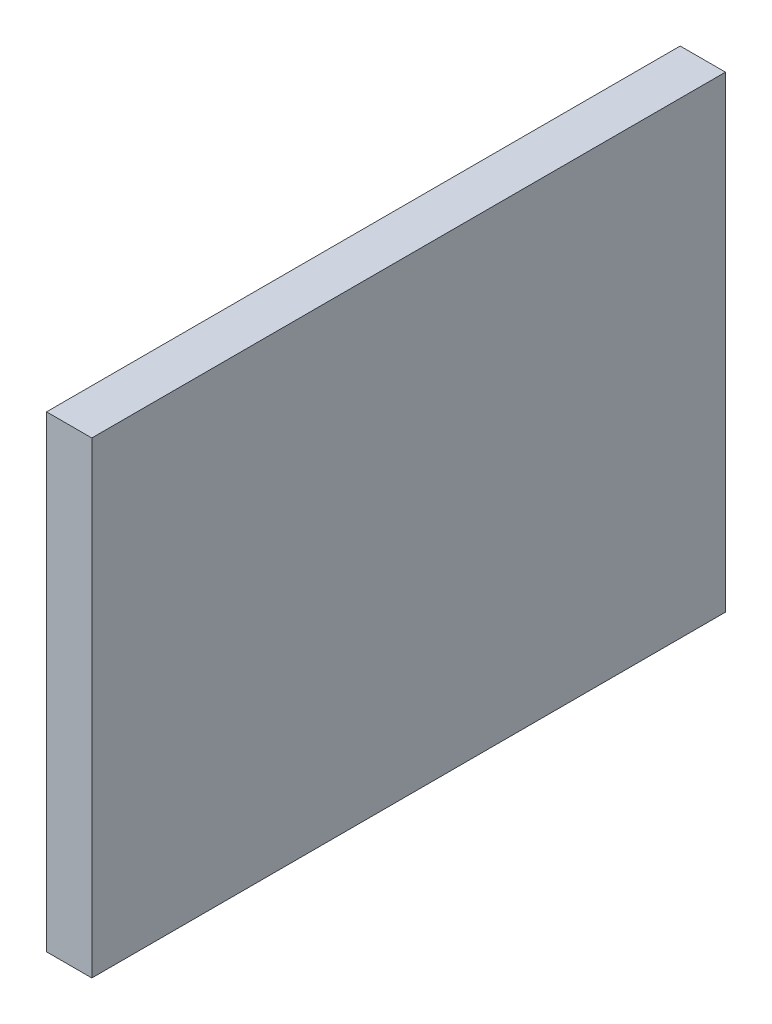
ISO-10303-21;
HEADER;
FILE_DESCRIPTION(('STEP AP214'),'2;1');
FILE_NAME('part.step','',(''),(''),'','','');
FILE_SCHEMA(('AUTOMOTIVE_DESIGN { 1 0 10303 214 1 1 1 1 }'));
ENDSEC;
DATA;
#1=APPLICATION_CONTEXT('core data for automotive mechanical design processes');
#2=APPLICATION_PROTOCOL_DEFINITION('international standard','automotive_design',2000,#1);
#3=PRODUCT_CONTEXT('',#1,'mechanical');
#4=PRODUCT('Part','Part','',(#3));
#5=PRODUCT_RELATED_PRODUCT_CATEGORY('part','',(#4));
#6=PRODUCT_DEFINITION_FORMATION('','',#4);
#7=PRODUCT_DEFINITION_CONTEXT('part definition',#1,'design');
#8=PRODUCT_DEFINITION('design','',#6,#7);
#9=PRODUCT_DEFINITION_SHAPE('','',#8);
#10=(LENGTH_UNIT() NAMED_UNIT(*) SI_UNIT(.MILLI.,.METRE.));
#11=(NAMED_UNIT(*) PLANE_ANGLE_UNIT() SI_UNIT($,.RADIAN.));
#12=(NAMED_UNIT(*) SI_UNIT($,.STERADIAN.) SOLID_ANGLE_UNIT());
#13=UNCERTAINTY_MEASURE_WITH_UNIT(LENGTH_MEASURE(1.E-05),#10,'distance_accuracy_value','');
#14=(GEOMETRIC_REPRESENTATION_CONTEXT(3) GLOBAL_UNCERTAINTY_ASSIGNED_CONTEXT((#13)) GLOBAL_UNIT_ASSIGNED_CONTEXT((#10,
#11,#12)) REPRESENTATION_CONTEXT('',''));
#15=CARTESIAN_POINT('',(0.,0.,0.));
#16=DIRECTION('',(0.,0.,1.));
#17=DIRECTION('',(1.,0.,0.));
#18=AXIS2_PLACEMENT_3D('',#15,#16,#17);
#19=CARTESIAN_POINT('',(0.,15.5,-21.));
#20=DIRECTION('',(1.,0.,0.));
#21=DIRECTION('',(0.,1.,0.));
#22=AXIS2_PLACEMENT_3D('',#19,#20,#21);
#23=PLANE('',#22);
#24=DIRECTION('',(0.,0.,-1.));
#25=VECTOR('',#24,1.);
#26=CARTESIAN_POINT('',(0.,12.9999999627471,-22.25));
#27=LINE('',#26,#25);
#28=CARTESIAN_POINT('',(0.,12.9999999627471,-18.5));
#29=VERTEX_POINT('',#28);
#30=CARTESIAN_POINT('',(0.,12.9999999627471,-23.5000000000004));
#31=VERTEX_POINT('',#30);
#32=EDGE_CURVE('E208',#29,#31,#27,.T.);
#33=ORIENTED_EDGE('',*,*,#32,.T.);
#34=CARTESIAN_POINT('',(0.,15.5,-23.5));
#35=DIRECTION('',(1.,0.,0.));
#36=DIRECTION('',(0.,0.999999973918284,0.000228393149992633));
#37=AXIS2_PLACEMENT_3D('',#34,#35,#36);
#38=CIRCLE('',#37,2.5000000372529);
#39=CARTESIAN_POINT('',(0.,17.9999999720486,-23.4994290171165));
#40=VERTEX_POINT('',#39);
#41=EDGE_CURVE('E203',#31,#40,#38,.T.);
#42=ORIENTED_EDGE('',*,*,#41,.T.);
#43=DIRECTION('',(0.,-0.000228393149993275,0.999999973918284));
#44=VECTOR('',#43,1.);
#45=CARTESIAN_POINT('',(0.,17.9991348696614,-19.7116518238196));
#46=LINE('',#45,#44);
#47=CARTESIAN_POINT('',(0.,17.9988407501343,-18.4238745001141));
#48=VERTEX_POINT('',#47);
#49=EDGE_CURVE('E128',#40,#48,#46,.T.);
#50=ORIENTED_EDGE('',*,*,#49,.T.);
#51=CARTESIAN_POINT('',(0.,15.5,-18.5));
#52=DIRECTION('',(1.,0.,0.));
#53=DIRECTION('',(0.,-1.,0.));
#54=AXIS2_PLACEMENT_3D('',#51,#52,#53);
#55=CIRCLE('',#54,2.5000000372529);
#56=EDGE_CURVE('E123',#48,#29,#55,.T.);
#57=ORIENTED_EDGE('',*,*,#56,.T.);
#58=EDGE_LOOP('',(#33,#42,#50,#57));
#59=FACE_BOUND('',#58,.T.);
#60=DIRECTION('',(0.,-1.,0.));
#61=VECTOR('',#60,1.);
#62=CARTESIAN_POINT('',(0.,31.,0.));
#63=LINE('',#62,#61);
#64=CARTESIAN_POINT('',(0.,31.,0.));
#65=VERTEX_POINT('',#64);
#66=CARTESIAN_POINT('',(0.,0.,0.));
#67=VERTEX_POINT('',#66);
#68=EDGE_CURVE('E25',#65,#67,#63,.T.);
#69=ORIENTED_EDGE('',*,*,#68,.F.);
#70=DIRECTION('',(0.,0.,1.));
#71=VECTOR('',#70,1.);
#72=CARTESIAN_POINT('',(0.,31.,-42.));
#73=LINE('',#72,#71);
#74=CARTESIAN_POINT('',(0.,31.,-42.));
#75=VERTEX_POINT('',#74);
#76=EDGE_CURVE('E198',#75,#65,#73,.T.);
#77=ORIENTED_EDGE('',*,*,#76,.F.);
#78=DIRECTION('',(0.,1.,0.));
#79=VECTOR('',#78,1.);
#80=CARTESIAN_POINT('',(0.,0.,-42.));
#81=LINE('',#80,#79);
#82=CARTESIAN_POINT('',(0.,0.,-42.));
#83=VERTEX_POINT('',#82);
#84=EDGE_CURVE('E229',#83,#75,#81,.T.);
#85=ORIENTED_EDGE('',*,*,#84,.F.);
#86=DIRECTION('',(0.,0.,-1.));
#87=VECTOR('',#86,1.);
#88=CARTESIAN_POINT('',(0.,0.,0.));
#89=LINE('',#88,#87);
#90=EDGE_CURVE('E234',#67,#83,#89,.T.);
#91=ORIENTED_EDGE('',*,*,#90,.F.);
#92=EDGE_LOOP('',(#69,#77,#85,#91));
#93=FACE_BOUND('',#92,.T.);
#94=ADVANCED_FACE('F16',(#59,#93),#23,.F.);
#95=CARTESIAN_POINT('',(3.,15.5,-21.));
#96=DIRECTION('',(1.,0.,0.));
#97=DIRECTION('',(0.,1.,0.));
#98=AXIS2_PLACEMENT_3D('',#95,#96,#97);
#99=PLANE('',#98);
#100=DIRECTION('',(0.,-1.,0.));
#101=VECTOR('',#100,1.);
#102=CARTESIAN_POINT('',(3.,31.,0.));
#103=LINE('',#102,#101);
#104=CARTESIAN_POINT('',(3.,31.,0.));
#105=VERTEX_POINT('',#104);
#106=CARTESIAN_POINT('',(3.,0.,0.));
#107=VERTEX_POINT('',#106);
#108=EDGE_CURVE('E10',#105,#107,#103,.T.);
#109=ORIENTED_EDGE('',*,*,#108,.T.);
#110=DIRECTION('',(0.,0.,-1.));
#111=VECTOR('',#110,1.);
#112=CARTESIAN_POINT('',(3.,0.,0.));
#113=LINE('',#112,#111);
#114=CARTESIAN_POINT('',(3.,0.,-42.));
#115=VERTEX_POINT('',#114);
#116=EDGE_CURVE('E238',#107,#115,#113,.T.);
#117=ORIENTED_EDGE('',*,*,#116,.T.);
#118=DIRECTION('',(0.,1.,0.));
#119=VECTOR('',#118,1.);
#120=CARTESIAN_POINT('',(3.,0.,-42.));
#121=LINE('',#120,#119);
#122=CARTESIAN_POINT('',(3.,31.,-42.));
#123=VERTEX_POINT('',#122);
#124=EDGE_CURVE('E167',#115,#123,#121,.T.);
#125=ORIENTED_EDGE('',*,*,#124,.T.);
#126=DIRECTION('',(0.,0.,1.));
#127=VECTOR('',#126,1.);
#128=CARTESIAN_POINT('',(3.,31.,-42.));
#129=LINE('',#128,#127);
#130=EDGE_CURVE('E194',#123,#105,#129,.T.);
#131=ORIENTED_EDGE('',*,*,#130,.T.);
#132=EDGE_LOOP('',(#109,#117,#125,#131));
#133=FACE_BOUND('',#132,.T.);
#134=ADVANCED_FACE('F343',(#133),#99,.T.);
#135=CARTESIAN_POINT('',(0.,31.,0.));
#136=DIRECTION('',(0.,0.,1.));
#137=DIRECTION('',(0.,-1.,0.));
#138=AXIS2_PLACEMENT_3D('',#135,#136,#137);
#139=PLANE('',#138);
#140=ORIENTED_EDGE('',*,*,#68,.T.);
#141=DIRECTION('',(1.,0.,0.));
#142=VECTOR('',#141,1.);
#143=CARTESIAN_POINT('',(0.,0.,0.));
#144=LINE('',#143,#142);
#145=EDGE_CURVE('E241',#67,#107,#144,.T.);
#146=ORIENTED_EDGE('',*,*,#145,.T.);
#147=ORIENTED_EDGE('',*,*,#108,.F.);
#148=DIRECTION('',(1.,0.,0.));
#149=VECTOR('',#148,1.);
#150=CARTESIAN_POINT('',(0.,31.,0.));
#151=LINE('',#150,#149);
#152=EDGE_CURVE('E191',#65,#105,#151,.T.);
#153=ORIENTED_EDGE('',*,*,#152,.F.);
#154=EDGE_LOOP('',(#140,#146,#147,#153));
#155=FACE_BOUND('',#154,.T.);
#156=ADVANCED_FACE('F18',(#155),#139,.T.);
#157=CARTESIAN_POINT('',(0.,0.,0.));
#158=DIRECTION('',(0.,-1.,0.));
#159=DIRECTION('',(0.,0.,-1.));
#160=AXIS2_PLACEMENT_3D('',#157,#158,#159);
#161=PLANE('',#160);
#162=ORIENTED_EDGE('',*,*,#90,.T.);
#163=DIRECTION('',(1.,0.,0.));
#164=VECTOR('',#163,1.);
#165=CARTESIAN_POINT('',(0.,0.,-42.));
#166=LINE('',#165,#164);
#167=EDGE_CURVE('E231',#83,#115,#166,.T.);
#168=ORIENTED_EDGE('',*,*,#167,.T.);
#169=ORIENTED_EDGE('',*,*,#116,.F.);
#170=ORIENTED_EDGE('',*,*,#145,.F.);
#171=EDGE_LOOP('',(#162,#168,#169,#170));
#172=FACE_BOUND('',#171,.T.);
#173=ADVANCED_FACE('F356',(#172),#161,.T.);
#174=CARTESIAN_POINT('',(0.,0.,-42.));
#175=DIRECTION('',(0.,0.,-1.));
#176=DIRECTION('',(0.,-1.,0.));
#177=AXIS2_PLACEMENT_3D('',#174,#175,#176);
#178=PLANE('',#177);
#179=ORIENTED_EDGE('',*,*,#84,.T.);
#180=DIRECTION('',(1.,0.,0.));
#181=VECTOR('',#180,1.);
#182=CARTESIAN_POINT('',(0.,31.,-42.));
#183=LINE('',#182,#181);
#184=EDGE_CURVE('E221',#75,#123,#183,.T.);
#185=ORIENTED_EDGE('',*,*,#184,.T.);
#186=ORIENTED_EDGE('',*,*,#124,.F.);
#187=ORIENTED_EDGE('',*,*,#167,.F.);
#188=EDGE_LOOP('',(#179,#185,#186,#187));
#189=FACE_BOUND('',#188,.T.);
#190=ADVANCED_FACE('F347',(#189),#178,.T.);
#191=CARTESIAN_POINT('',(0.,31.,-42.));
#192=DIRECTION('',(0.,1.,0.));
#193=DIRECTION('',(1.,0.,0.));
#194=AXIS2_PLACEMENT_3D('',#191,#192,#193);
#195=PLANE('',#194);
#196=ORIENTED_EDGE('',*,*,#76,.T.);
#197=ORIENTED_EDGE('',*,*,#152,.T.);
#198=ORIENTED_EDGE('',*,*,#130,.F.);
#199=ORIENTED_EDGE('',*,*,#184,.F.);
#200=EDGE_LOOP('',(#196,#197,#198,#199));
#201=FACE_BOUND('',#200,.T.);
#202=ADVANCED_FACE('F352',(#201),#195,.T.);
#203=CARTESIAN_POINT('',(0.,15.5,-18.5));
#204=DIRECTION('',(-1.,0.,0.));
#205=DIRECTION('',(0.,-1.,0.));
#206=AXIS2_PLACEMENT_3D('',#203,#204,#205);
#207=CYLINDRICAL_SURFACE('',#206,2.5000000372529);
#208=CARTESIAN_POINT('',(-4.,15.5,-18.5));
#209=DIRECTION('',(-1.,0.,0.));
#210=DIRECTION('',(0.,-1.,0.));
#211=AXIS2_PLACEMENT_3D('',#208,#209,#210);
#212=CIRCLE('',#211,2.5000000372529);
#213=CARTESIAN_POINT('',(-4.,12.9999999627471,-18.5));
#214=VERTEX_POINT('',#213);
#215=CARTESIAN_POINT('',(-4.,17.9988407501343,-18.4238745001141));
#216=VERTEX_POINT('',#215);
#217=EDGE_CURVE('E121',#214,#216,#212,.T.);
#218=ORIENTED_EDGE('',*,*,#217,.F.);
#219=DIRECTION('',(-1.,0.,0.));
#220=VECTOR('',#219,1.);
#221=CARTESIAN_POINT('',(0.,12.9999999627471,-18.5));
#222=LINE('',#221,#220);
#223=EDGE_CURVE('E212',#29,#214,#222,.T.);
#224=ORIENTED_EDGE('',*,*,#223,.F.);
#225=ORIENTED_EDGE('',*,*,#56,.F.);
#226=DIRECTION('',(-1.,0.,0.));
#227=VECTOR('',#226,1.);
#228=CARTESIAN_POINT('',(0.,17.9988407501343,-18.4238745001141));
#229=LINE('',#228,#227);
#230=EDGE_CURVE('E117',#48,#216,#229,.T.);
#231=ORIENTED_EDGE('',*,*,#230,.T.);
#232=EDGE_LOOP('',(#218,#224,#225,#231));
#233=FACE_BOUND('',#232,.T.);
#234=ADVANCED_FACE('F118',(#233),#207,.T.);
#235=CARTESIAN_POINT('',(0.,12.9999999627471,-23.5));
#236=DIRECTION('',(0.,-1.,0.));
#237=DIRECTION('',(-1.,0.,0.));
#238=AXIS2_PLACEMENT_3D('',#235,#236,#237);
#239=PLANE('',#238);
#240=DIRECTION('',(0.,0.,1.));
#241=VECTOR('',#240,1.);
#242=CARTESIAN_POINT('',(-4.,12.9999999627471,-22.25));
#243=LINE('',#242,#241);
#244=CARTESIAN_POINT('',(-4.,12.9999999627471,-23.5000000000004));
#245=VERTEX_POINT('',#244);
#246=EDGE_CURVE('E169',#245,#214,#243,.T.);
#247=ORIENTED_EDGE('',*,*,#246,.F.);
#248=DIRECTION('',(-1.,0.,0.));
#249=VECTOR('',#248,1.);
#250=CARTESIAN_POINT('',(0.,12.9999999627471,-23.5000000000004));
#251=LINE('',#250,#249);
#252=EDGE_CURVE('E127',#31,#245,#251,.T.);
#253=ORIENTED_EDGE('',*,*,#252,.F.);
#254=ORIENTED_EDGE('',*,*,#32,.F.);
#255=ORIENTED_EDGE('',*,*,#223,.T.);
#256=EDGE_LOOP('',(#247,#253,#254,#255));
#257=FACE_BOUND('',#256,.T.);
#258=ADVANCED_FACE('F379',(#257),#239,.T.);
#259=CARTESIAN_POINT('',(-5.,15.5,-21.));
#260=DIRECTION('',(-1.,0.,0.));
#261=DIRECTION('',(0.,0.,1.));
#262=AXIS2_PLACEMENT_3D('',#259,#260,#261);
#263=PLANE('',#262);
#264=DIRECTION('',(0.,-0.000228393149993275,0.999999973918284));
#265=VECTOR('',#264,1.);
#266=CARTESIAN_POINT('',(-5.,16.9991348957431,-19.7118802169696));
#267=LINE('',#266,#265);
#268=CARTESIAN_POINT('',(-5.,16.9999999981303,-23.4996574102665));
#269=VERTEX_POINT('',#268);
#270=CARTESIAN_POINT('',(-5.,16.9988446668375,-18.4411376482661));
#271=VERTEX_POINT('',#270);
#272=EDGE_CURVE('E147',#269,#271,#267,.T.);
#273=ORIENTED_EDGE('',*,*,#272,.F.);
#274=CARTESIAN_POINT('',(-5.,15.5,-23.5));
#275=DIRECTION('',(1.,0.,0.));
#276=DIRECTION('',(0.,-0.999999973918284,-0.000228393149992633));
#277=AXIS2_PLACEMENT_3D('',#274,#275,#276);
#278=CIRCLE('',#277,1.5000000372529);
#279=CARTESIAN_POINT('',(-5.,13.9999999627471,-23.5));
#280=VERTEX_POINT('',#279);
#281=EDGE_CURVE('E184',#280,#269,#278,.T.);
#282=ORIENTED_EDGE('',*,*,#281,.F.);
#283=DIRECTION('',(0.,0.,-1.));
#284=VECTOR('',#283,1.);
#285=CARTESIAN_POINT('',(-5.,13.9999999627471,-22.25));
#286=LINE('',#285,#284);
#287=CARTESIAN_POINT('',(-5.,13.9999999627471,-18.5));
#288=VERTEX_POINT('',#287);
#289=EDGE_CURVE('E171',#288,#280,#286,.T.);
#290=ORIENTED_EDGE('',*,*,#289,.F.);
#291=CARTESIAN_POINT('',(-5.,15.5,-18.5));
#292=DIRECTION('',(1.,0.,0.));
#293=DIRECTION('',(0.,-1.,0.));
#294=AXIS2_PLACEMENT_3D('',#291,#292,#293);
#295=CIRCLE('',#294,1.5000000372529);
#296=EDGE_CURVE('E142',#271,#288,#295,.T.);
#297=ORIENTED_EDGE('',*,*,#296,.F.);
#298=EDGE_LOOP('',(#273,#282,#290,#297));
#299=FACE_BOUND('',#298,.T.);
#300=ADVANCED_FACE('F380',(#299),#263,.T.);
#301=CARTESIAN_POINT('',(0.,17.9988407501343,-18.4238745001141));
#302=DIRECTION('',(0.,0.999999973918284,0.000228393149993275));
#303=DIRECTION('',(1.,0.,0.));
#304=AXIS2_PLACEMENT_3D('',#301,#302,#303);
#305=PLANE('',#304);
#306=DIRECTION('',(0.,0.000228393149993275,-0.999999973918284));
#307=VECTOR('',#306,1.);
#308=CARTESIAN_POINT('',(-4.,17.9991348696614,-19.7116518238196));
#309=LINE('',#308,#307);
#310=CARTESIAN_POINT('',(-4.,17.9999999720486,-23.4994290171165));
#311=VERTEX_POINT('',#310);
#312=EDGE_CURVE('E146',#216,#311,#309,.T.);
#313=ORIENTED_EDGE('',*,*,#312,.F.);
#314=ORIENTED_EDGE('',*,*,#230,.F.);
#315=ORIENTED_EDGE('',*,*,#49,.F.);
#316=DIRECTION('',(-1.,0.,0.));
#317=VECTOR('',#316,1.);
#318=CARTESIAN_POINT('',(0.,17.9999999720486,-23.4994290171165));
#319=LINE('',#318,#317);
#320=EDGE_CURVE('E143',#40,#311,#319,.T.);
#321=ORIENTED_EDGE('',*,*,#320,.T.);
#322=EDGE_LOOP('',(#313,#314,#315,#321));
#323=FACE_BOUND('',#322,.T.);
#324=ADVANCED_FACE('F152',(#323),#305,.T.);
#325=CARTESIAN_POINT('',(0.,15.5,-23.5));
#326=DIRECTION('',(-1.,0.,0.));
#327=DIRECTION('',(0.,0.000114196575818401,-0.999999993479571));
#328=AXIS2_PLACEMENT_3D('',#325,#326,#327);
#329=CYLINDRICAL_SURFACE('',#328,2.5000000372529);
#330=CARTESIAN_POINT('',(-4.,15.5,-23.5));
#331=DIRECTION('',(-1.,0.,0.));
#332=DIRECTION('',(0.,-0.999999973918284,-0.000228393149992633));
#333=AXIS2_PLACEMENT_3D('',#330,#331,#332);
#334=CIRCLE('',#333,2.5000000372529);
#335=EDGE_CURVE('E185',#311,#245,#334,.T.);
#336=ORIENTED_EDGE('',*,*,#335,.F.);
#337=ORIENTED_EDGE('',*,*,#320,.F.);
#338=ORIENTED_EDGE('',*,*,#41,.F.);
#339=ORIENTED_EDGE('',*,*,#252,.T.);
#340=EDGE_LOOP('',(#336,#337,#338,#339));
#341=FACE_BOUND('',#340,.T.);
#342=ADVANCED_FACE('F369',(#341),#329,.T.);
#343=CARTESIAN_POINT('',(-4.5,15.5,-18.5));
#344=DIRECTION('',(1.,0.,0.));
#345=DIRECTION('',(0.,-1.,0.));
#346=AXIS2_PLACEMENT_3D('',#343,#344,#345);
#347=CONICAL_SURFACE('',#346,2.0000000372529,0.785398163397449);
#348=ORIENTED_EDGE('',*,*,#296,.T.);
#349=DIRECTION('',(-0.707106781186548,0.707106781186547,0.));
#350=VECTOR('',#349,1.);
#351=CARTESIAN_POINT('',(-4.,12.9999999627471,-18.5));
#352=LINE('',#351,#350);
#353=EDGE_CURVE('E137',#214,#288,#352,.T.);
#354=ORIENTED_EDGE('',*,*,#353,.F.);
#355=ORIENTED_EDGE('',*,*,#217,.T.);
#356=CARTESIAN_POINT('',(-5.,16.9988446668375,-18.4411376482661));
#357=CARTESIAN_POINT('',(-4.67326155119582,17.3255816508833,-18.4346870160471));
#358=CARTESIAN_POINT('',(-4.32626993835325,17.6725719465834,-18.4288803946926));
#359=CARTESIAN_POINT('',(-4.,17.9988407501343,-18.4238745001141));
#360=(BOUNDED_CURVE() B_SPLINE_CURVE(3,(#356,#357,#358,#359),.UNSPECIFIED.,.F.,
.F.) B_SPLINE_CURVE_WITH_KNOTS((4,4),(0.,0.138636580019027),
.UNSPECIFIED.) CURVE() GEOMETRIC_REPRESENTATION_ITEM() RATIONAL_B_SPLINE_CURVE((1.,1.,1.,1.)) REPRESENTATION_ITEM(''));
#361=EDGE_CURVE('E136',#271,#216,#360,.T.);
#362=ORIENTED_EDGE('',*,*,#361,.F.);
#363=EDGE_LOOP('',(#348,#354,#355,#362));
#364=FACE_BOUND('',#363,.T.);
#365=ADVANCED_FACE('F134',(#364),#347,.T.);
#366=CARTESIAN_POINT('',(-4.5,13.4999999627471,-22.25));
#367=DIRECTION('',(-0.707106781186547,-0.707106781186548,0.));
#368=DIRECTION('',(-0.707106781186548,0.707106781186547,0.));
#369=AXIS2_PLACEMENT_3D('',#366,#367,#368);
#370=PLANE('',#369);
#371=ORIENTED_EDGE('',*,*,#353,.T.);
#372=ORIENTED_EDGE('',*,*,#289,.T.);
#373=DIRECTION('',(-0.707106781186547,0.707106781186548,1.09906472107864E-13));
#374=VECTOR('',#373,1.);
#375=CARTESIAN_POINT('',(-4.,12.9999999627471,-23.5000000000004));
#376=LINE('',#375,#374);
#377=EDGE_CURVE('E155',#245,#280,#376,.T.);
#378=ORIENTED_EDGE('',*,*,#377,.F.);
#379=ORIENTED_EDGE('',*,*,#246,.T.);
#380=EDGE_LOOP('',(#371,#372,#378,#379));
#381=FACE_BOUND('',#380,.T.);
#382=ADVANCED_FACE('F370',(#381),#370,.T.);
#383=CARTESIAN_POINT('',(-4.5,15.5,-23.5));
#384=DIRECTION('',(1.,0.,0.));
#385=DIRECTION('',(0.,-0.999999973918284,-0.000228393149992633));
#386=AXIS2_PLACEMENT_3D('',#383,#384,#385);
#387=CONICAL_SURFACE('',#386,2.0000000372529,0.785398163397449);
#388=ORIENTED_EDGE('',*,*,#377,.T.);
#389=ORIENTED_EDGE('',*,*,#281,.T.);
#390=DIRECTION('',(-0.707106781186547,-0.70710676274399,-0.000161498345136222));
#391=VECTOR('',#390,1.);
#392=CARTESIAN_POINT('',(-4.,17.9999999720486,-23.4994290171165));
#393=LINE('',#392,#391);
#394=EDGE_CURVE('E158',#311,#269,#393,.T.);
#395=ORIENTED_EDGE('',*,*,#394,.F.);
#396=ORIENTED_EDGE('',*,*,#335,.T.);
#397=EDGE_LOOP('',(#388,#389,#395,#396));
#398=FACE_BOUND('',#397,.T.);
#399=ADVANCED_FACE('F442',(#398),#387,.T.);
#400=CARTESIAN_POINT('',(-4.5,17.4991348827023,-19.7117660203946));
#401=DIRECTION('',(-0.707106781186548,0.707106762743989,0.000161498345136801));
#402=DIRECTION('',(0.00022839314403639,0.,0.999999973918286));
#403=AXIS2_PLACEMENT_3D('',#400,#401,#402);
#404=PLANE('',#403);
#405=ORIENTED_EDGE('',*,*,#312,.T.);
#406=ORIENTED_EDGE('',*,*,#394,.T.);
#407=ORIENTED_EDGE('',*,*,#272,.T.);
#408=ORIENTED_EDGE('',*,*,#361,.T.);
#409=EDGE_LOOP('',(#405,#406,#407,#408));
#410=FACE_BOUND('',#409,.T.);
#411=ADVANCED_FACE('F148',(#410),#404,.T.);
#412=CLOSED_SHELL('',(#94,#134,#156,#173,#190,#202,#234,#258,#300,#324,#342,#365,#382,#399,#411));
#413=MANIFOLD_SOLID_BREP('B1',#412);
#414=ADVANCED_BREP_SHAPE_REPRESENTATION('',(#18,#413),#14);
#415=SHAPE_DEFINITION_REPRESENTATION(#9,#414);
ENDSEC;
END-ISO-10303-21;
